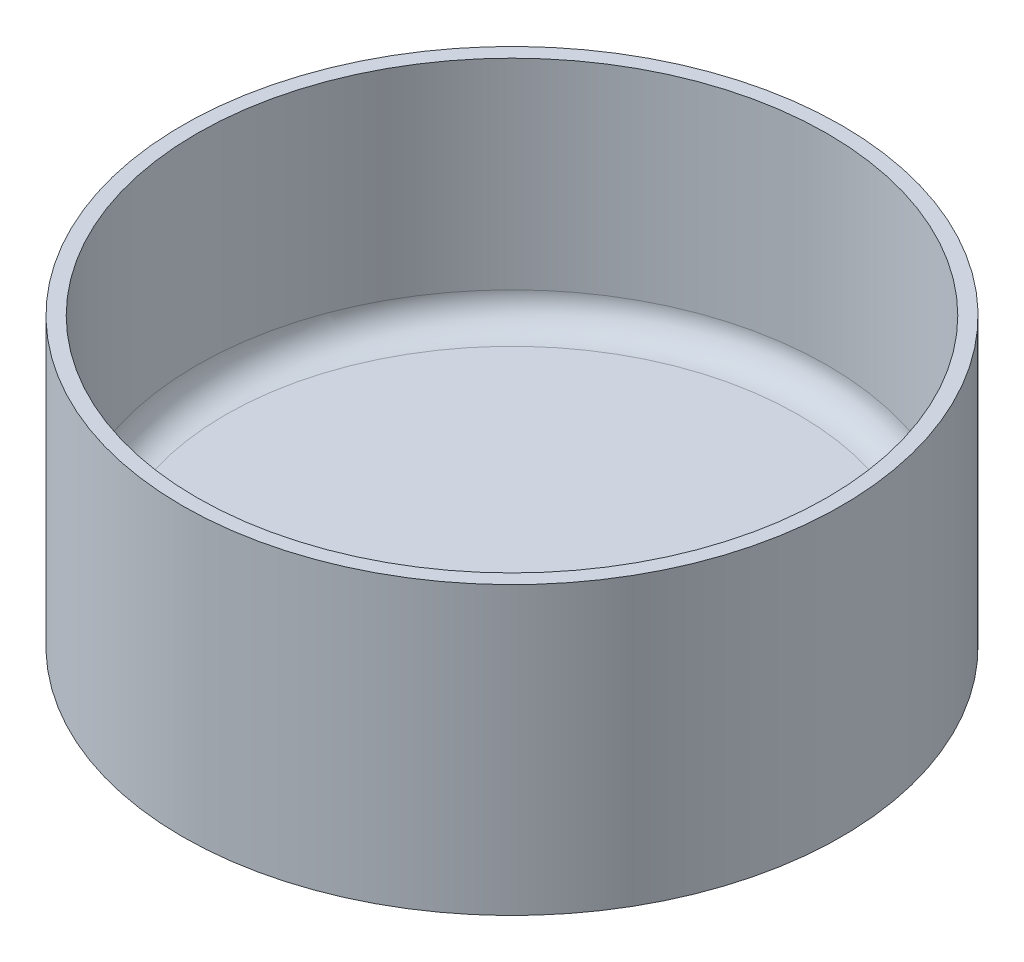
ISO-10303-21;
HEADER;
FILE_DESCRIPTION(('STEP AP214'),'2;1');
FILE_NAME('part.step','',(''),(''),'','','');
FILE_SCHEMA(('AUTOMOTIVE_DESIGN { 1 0 10303 214 1 1 1 1 }'));
ENDSEC;
DATA;
#1=APPLICATION_CONTEXT('core data for automotive mechanical design processes');
#2=APPLICATION_PROTOCOL_DEFINITION('international standard','automotive_design',2000,#1);
#3=PRODUCT_CONTEXT('',#1,'mechanical');
#4=PRODUCT('Part','Part','',(#3));
#5=PRODUCT_RELATED_PRODUCT_CATEGORY('part','',(#4));
#6=PRODUCT_DEFINITION_FORMATION('','',#4);
#7=PRODUCT_DEFINITION_CONTEXT('part definition',#1,'design');
#8=PRODUCT_DEFINITION('design','',#6,#7);
#9=PRODUCT_DEFINITION_SHAPE('','',#8);
#10=(LENGTH_UNIT() NAMED_UNIT(*) SI_UNIT(.MILLI.,.METRE.));
#11=(NAMED_UNIT(*) PLANE_ANGLE_UNIT() SI_UNIT($,.RADIAN.));
#12=(NAMED_UNIT(*) SI_UNIT($,.STERADIAN.) SOLID_ANGLE_UNIT());
#13=UNCERTAINTY_MEASURE_WITH_UNIT(LENGTH_MEASURE(1.E-05),#10,'distance_accuracy_value','');
#14=(GEOMETRIC_REPRESENTATION_CONTEXT(3) GLOBAL_UNCERTAINTY_ASSIGNED_CONTEXT((#13)) GLOBAL_UNIT_ASSIGNED_CONTEXT((#10,
#11,#12)) REPRESENTATION_CONTEXT('',''));
#15=CARTESIAN_POINT('',(0.,0.,0.));
#16=DIRECTION('',(0.,0.,1.));
#17=DIRECTION('',(1.,0.,0.));
#18=AXIS2_PLACEMENT_3D('',#15,#16,#17);
#19=CARTESIAN_POINT('',(0.,10.,0.));
#20=DIRECTION('',(0.,-1.,0.));
#21=DIRECTION('',(0.,0.,-1.));
#22=AXIS2_PLACEMENT_3D('',#19,#20,#21);
#23=CYLINDRICAL_SURFACE('',#22,11.5);
#24=CARTESIAN_POINT('',(0.,10.,0.));
#25=DIRECTION('',(0.,1.,0.));
#26=DIRECTION('',(0.,0.,1.));
#27=AXIS2_PLACEMENT_3D('',#24,#25,#26);
#28=CIRCLE('',#27,11.5);
#29=CARTESIAN_POINT('',(0.,10.,11.5));
#30=VERTEX_POINT('',#29);
#31=EDGE_CURVE('E54',#30,#30,#28,.T.);
#32=ORIENTED_EDGE('',*,*,#31,.F.);
#33=EDGE_LOOP('',(#32));
#34=FACE_BOUND('',#33,.T.);
#35=CARTESIAN_POINT('',(0.,0.,0.));
#36=DIRECTION('',(0.,1.,0.));
#37=DIRECTION('',(0.,0.,1.));
#38=AXIS2_PLACEMENT_3D('',#35,#36,#37);
#39=CIRCLE('',#38,11.5);
#40=CARTESIAN_POINT('',(0.,0.,11.5));
#41=VERTEX_POINT('',#40);
#42=EDGE_CURVE('E59',#41,#41,#39,.T.);
#43=ORIENTED_EDGE('',*,*,#42,.T.);
#44=EDGE_LOOP('',(#43));
#45=FACE_BOUND('',#44,.T.);
#46=ADVANCED_FACE('F41',(#34,#45),#23,.T.);
#47=CARTESIAN_POINT('',(0.,10.,0.));
#48=DIRECTION('',(0.,1.,0.));
#49=DIRECTION('',(0.,0.,1.));
#50=AXIS2_PLACEMENT_3D('',#47,#48,#49);
#51=PLANE('',#50);
#52=CARTESIAN_POINT('',(0.,10.,0.));
#53=DIRECTION('',(0.,1.,0.));
#54=DIRECTION('',(0.,0.,1.));
#55=AXIS2_PLACEMENT_3D('',#52,#53,#54);
#56=CIRCLE('',#55,11.);
#57=CARTESIAN_POINT('',(0.,10.,11.));
#58=VERTEX_POINT('',#57);
#59=EDGE_CURVE('E64',#58,#58,#56,.T.);
#60=ORIENTED_EDGE('',*,*,#59,.F.);
#61=EDGE_LOOP('',(#60));
#62=FACE_BOUND('',#61,.T.);
#63=ORIENTED_EDGE('',*,*,#31,.T.);
#64=EDGE_LOOP('',(#63));
#65=FACE_BOUND('',#64,.T.);
#66=ADVANCED_FACE('F72',(#62,#65),#51,.T.);
#67=CARTESIAN_POINT('',(0.,0.,0.));
#68=DIRECTION('',(0.,1.,0.));
#69=DIRECTION('',(0.,0.,1.));
#70=AXIS2_PLACEMENT_3D('',#67,#68,#69);
#71=PLANE('',#70);
#72=ORIENTED_EDGE('',*,*,#42,.F.);
#73=EDGE_LOOP('',(#72));
#74=FACE_BOUND('',#73,.T.);
#75=ADVANCED_FACE('F75',(#74),#71,.F.);
#76=CARTESIAN_POINT('',(0.,-31.1126983722081,0.));
#77=DIRECTION('',(0.,1.,0.));
#78=DIRECTION('',(0.,0.,1.));
#79=AXIS2_PLACEMENT_3D('',#76,#77,#78);
#80=CYLINDRICAL_SURFACE('',#79,11.);
#81=CARTESIAN_POINT('',(0.,3.,0.));
#82=DIRECTION('',(0.,1.,0.));
#83=DIRECTION('',(0.,0.,1.));
#84=AXIS2_PLACEMENT_3D('',#81,#82,#83);
#85=CIRCLE('',#84,11.);
#86=CARTESIAN_POINT('',(0.,3.,11.));
#87=VERTEX_POINT('',#86);
#88=EDGE_CURVE('E49',#87,#87,#85,.F.);
#89=ORIENTED_EDGE('',*,*,#88,.T.);
#90=EDGE_LOOP('',(#89));
#91=FACE_BOUND('',#90,.T.);
#92=ORIENTED_EDGE('',*,*,#59,.T.);
#93=EDGE_LOOP('',(#92));
#94=FACE_BOUND('',#93,.T.);
#95=ADVANCED_FACE('F70',(#91,#94),#80,.F.);
#96=CARTESIAN_POINT('',(0.,2.,0.));
#97=DIRECTION('',(0.,1.,0.));
#98=DIRECTION('',(0.,0.,1.));
#99=AXIS2_PLACEMENT_3D('',#96,#97,#98);
#100=PLANE('',#99);
#101=CARTESIAN_POINT('',(0.,2.,0.));
#102=DIRECTION('',(0.,1.,0.));
#103=DIRECTION('',(0.,0.,1.));
#104=AXIS2_PLACEMENT_3D('',#101,#102,#103);
#105=CIRCLE('',#104,10.);
#106=CARTESIAN_POINT('',(0.,2.,10.));
#107=VERTEX_POINT('',#106);
#108=EDGE_CURVE('E11',#107,#107,#105,.T.);
#109=ORIENTED_EDGE('',*,*,#108,.T.);
#110=EDGE_LOOP('',(#109));
#111=FACE_BOUND('',#110,.T.);
#112=ADVANCED_FACE('F88',(#111),#100,.T.);
#113=CARTESIAN_POINT('',(0.,3.,0.));
#114=DIRECTION('',(0.,1.,0.));
#115=DIRECTION('',(0.,0.,1.));
#116=AXIS2_PLACEMENT_3D('',#113,#114,#115);
#117=TOROIDAL_SURFACE('',#116,10.,1.);
#118=ORIENTED_EDGE('',*,*,#108,.F.);
#119=EDGE_LOOP('',(#118));
#120=FACE_BOUND('',#119,.T.);
#121=ORIENTED_EDGE('',*,*,#88,.F.);
#122=EDGE_LOOP('',(#121));
#123=FACE_BOUND('',#122,.T.);
#124=ADVANCED_FACE('F43',(#120,#123),#117,.F.);
#125=CLOSED_SHELL('',(#46,#66,#75,#95,#112,#124));
#126=MANIFOLD_SOLID_BREP('B2',#125);
#127=ADVANCED_BREP_SHAPE_REPRESENTATION('',(#18,#126),#14);
#128=SHAPE_DEFINITION_REPRESENTATION(#9,#127);
ENDSEC;
END-ISO-10303-21;
